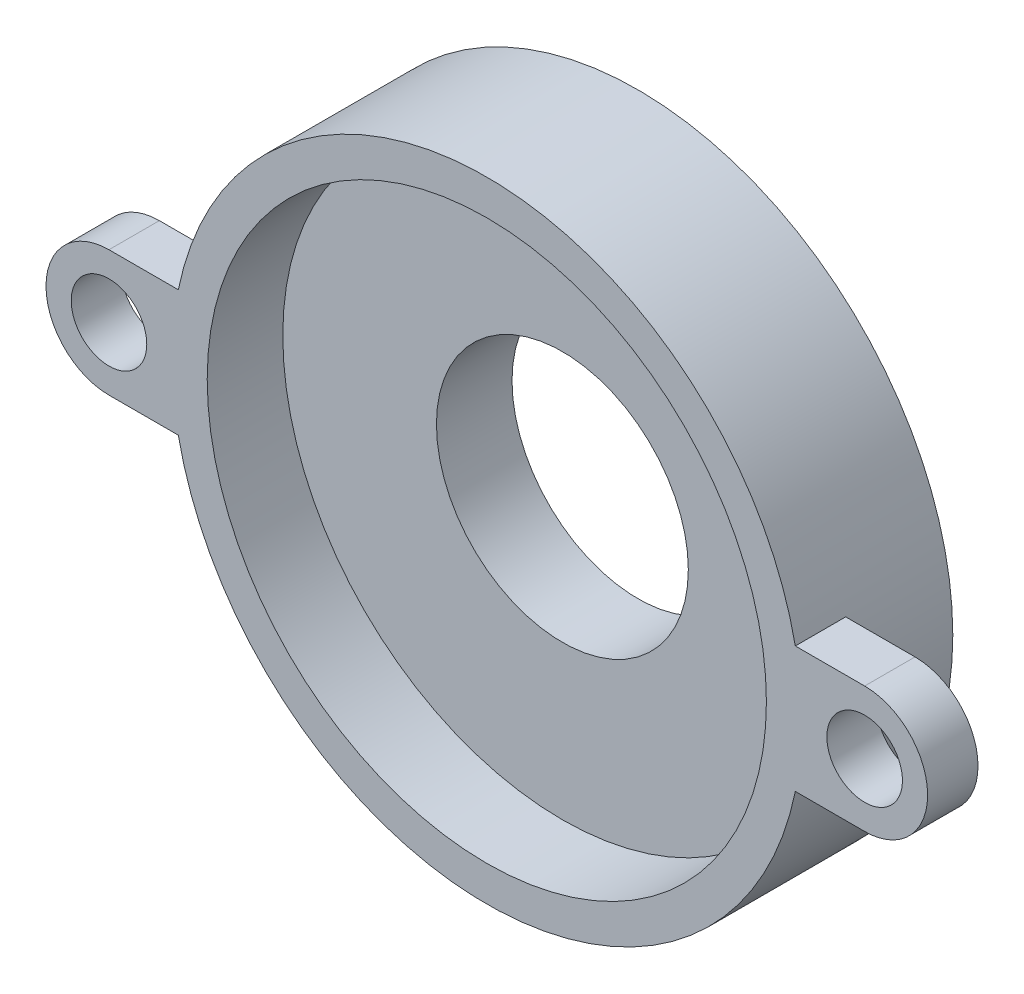
ISO-10303-21;
HEADER;
FILE_DESCRIPTION(('STEP AP214'),'2;1');
FILE_NAME('part.step','',(''),(''),'','','');
FILE_SCHEMA(('AUTOMOTIVE_DESIGN { 1 0 10303 214 1 1 1 1 }'));
ENDSEC;
DATA;
#1=APPLICATION_CONTEXT('core data for automotive mechanical design processes');
#2=APPLICATION_PROTOCOL_DEFINITION('international standard','automotive_design',2000,#1);
#3=PRODUCT_CONTEXT('',#1,'mechanical');
#4=PRODUCT('Part','Part','',(#3));
#5=PRODUCT_RELATED_PRODUCT_CATEGORY('part','',(#4));
#6=PRODUCT_DEFINITION_FORMATION('','',#4);
#7=PRODUCT_DEFINITION_CONTEXT('part definition',#1,'design');
#8=PRODUCT_DEFINITION('design','',#6,#7);
#9=PRODUCT_DEFINITION_SHAPE('','',#8);
#10=(LENGTH_UNIT() NAMED_UNIT(*) SI_UNIT(.MILLI.,.METRE.));
#11=(NAMED_UNIT(*) PLANE_ANGLE_UNIT() SI_UNIT($,.RADIAN.));
#12=(NAMED_UNIT(*) SI_UNIT($,.STERADIAN.) SOLID_ANGLE_UNIT());
#13=UNCERTAINTY_MEASURE_WITH_UNIT(LENGTH_MEASURE(1.E-05),#10,'distance_accuracy_value','');
#14=(GEOMETRIC_REPRESENTATION_CONTEXT(3) GLOBAL_UNCERTAINTY_ASSIGNED_CONTEXT((#13)) GLOBAL_UNIT_ASSIGNED_CONTEXT((#10,
#11,#12)) REPRESENTATION_CONTEXT('',''));
#15=CARTESIAN_POINT('',(0.,0.,0.));
#16=DIRECTION('',(0.,0.,1.));
#17=DIRECTION('',(1.,0.,0.));
#18=AXIS2_PLACEMENT_3D('',#15,#16,#17);
#19=CARTESIAN_POINT('',(0.,0.,6.));
#20=DIRECTION('',(0.,0.,-1.));
#21=DIRECTION('',(-1.,0.,0.));
#22=AXIS2_PLACEMENT_3D('',#19,#20,#21);
#23=CYLINDRICAL_SURFACE('',#22,5.);
#24=CARTESIAN_POINT('',(0.,0.,0.));
#25=DIRECTION('',(0.,0.,1.));
#26=DIRECTION('',(1.,0.,0.));
#27=AXIS2_PLACEMENT_3D('',#24,#25,#26);
#28=CIRCLE('',#27,5.);
#29=CARTESIAN_POINT('',(5.,0.,0.));
#30=VERTEX_POINT('',#29);
#31=EDGE_CURVE('E182',#30,#30,#28,.T.);
#32=ORIENTED_EDGE('',*,*,#31,.F.);
#33=EDGE_LOOP('',(#32));
#34=FACE_BOUND('',#33,.T.);
#35=CARTESIAN_POINT('',(0.,0.,3.));
#36=DIRECTION('',(0.,0.,1.));
#37=DIRECTION('',(1.,0.,0.));
#38=AXIS2_PLACEMENT_3D('',#35,#36,#37);
#39=CIRCLE('',#38,5.);
#40=CARTESIAN_POINT('',(5.,0.,3.));
#41=VERTEX_POINT('',#40);
#42=EDGE_CURVE('E39',#41,#41,#39,.T.);
#43=ORIENTED_EDGE('',*,*,#42,.T.);
#44=EDGE_LOOP('',(#43));
#45=FACE_BOUND('',#44,.T.);
#46=ADVANCED_FACE('F35',(#34,#45),#23,.F.);
#47=CARTESIAN_POINT('',(0.,0.,6.));
#48=DIRECTION('',(0.,0.,1.));
#49=DIRECTION('',(1.,0.,0.));
#50=AXIS2_PLACEMENT_3D('',#47,#48,#49);
#51=PLANE('',#50);
#52=CARTESIAN_POINT('',(0.,0.,6.));
#53=DIRECTION('',(0.,0.,1.));
#54=DIRECTION('',(1.,0.,0.));
#55=AXIS2_PLACEMENT_3D('',#52,#53,#54);
#56=CIRCLE('',#55,11.1);
#57=CARTESIAN_POINT('',(11.1,0.,6.));
#58=VERTEX_POINT('',#57);
#59=EDGE_CURVE('E170',#58,#58,#56,.T.);
#60=ORIENTED_EDGE('',*,*,#59,.F.);
#61=EDGE_LOOP('',(#60));
#62=FACE_BOUND('',#61,.T.);
#63=CARTESIAN_POINT('',(0.,0.,6.));
#64=DIRECTION('',(0.,0.,1.));
#65=DIRECTION('',(1.,0.,0.));
#66=AXIS2_PLACEMENT_3D('',#63,#64,#65);
#67=CIRCLE('',#66,12.5);
#68=CARTESIAN_POINT('',(-12.2474487139159,-2.5,6.));
#69=VERTEX_POINT('',#68);
#70=CARTESIAN_POINT('',(12.2474487139159,-2.49999999999999,6.));
#71=VERTEX_POINT('',#70);
#72=EDGE_CURVE('E11',#69,#71,#67,.T.);
#73=ORIENTED_EDGE('',*,*,#72,.T.);
#74=DIRECTION('',(1.,0.,0.));
#75=VECTOR('',#74,1.);
#76=CARTESIAN_POINT('',(15.,-2.49999999999999,6.));
#77=LINE('',#76,#75);
#78=CARTESIAN_POINT('',(15.,-2.49999999999999,6.));
#79=VERTEX_POINT('',#78);
#80=EDGE_CURVE('E124',#71,#79,#77,.T.);
#81=ORIENTED_EDGE('',*,*,#80,.T.);
#82=CARTESIAN_POINT('',(15.,0.,6.));
#83=DIRECTION('',(0.,0.,1.));
#84=DIRECTION('',(-1.,0.,0.));
#85=AXIS2_PLACEMENT_3D('',#82,#83,#84);
#86=CIRCLE('',#85,2.5);
#87=CARTESIAN_POINT('',(15.,2.50000000000001,6.));
#88=VERTEX_POINT('',#87);
#89=EDGE_CURVE('E134',#79,#88,#86,.T.);
#90=ORIENTED_EDGE('',*,*,#89,.T.);
#91=DIRECTION('',(-1.,0.,0.));
#92=VECTOR('',#91,1.);
#93=CARTESIAN_POINT('',(15.,2.50000000000001,6.));
#94=LINE('',#93,#92);
#95=CARTESIAN_POINT('',(12.2474487139159,2.50000000000001,6.));
#96=VERTEX_POINT('',#95);
#97=EDGE_CURVE('E52',#88,#96,#94,.T.);
#98=ORIENTED_EDGE('',*,*,#97,.T.);
#99=CARTESIAN_POINT('',(-12.2474487139159,2.5,6.));
#100=VERTEX_POINT('',#99);
#101=EDGE_CURVE('E44',#96,#100,#67,.T.);
#102=ORIENTED_EDGE('',*,*,#101,.T.);
#103=DIRECTION('',(-1.,0.,0.));
#104=VECTOR('',#103,1.);
#105=CARTESIAN_POINT('',(-15.,2.5,6.));
#106=LINE('',#105,#104);
#107=CARTESIAN_POINT('',(-15.,2.5,6.));
#108=VERTEX_POINT('',#107);
#109=EDGE_CURVE('E154',#100,#108,#106,.T.);
#110=ORIENTED_EDGE('',*,*,#109,.T.);
#111=CARTESIAN_POINT('',(-15.,0.,6.));
#112=DIRECTION('',(0.,0.,1.));
#113=DIRECTION('',(1.,0.,0.));
#114=AXIS2_PLACEMENT_3D('',#111,#112,#113);
#115=CIRCLE('',#114,2.5);
#116=CARTESIAN_POINT('',(-15.,-2.5,6.));
#117=VERTEX_POINT('',#116);
#118=EDGE_CURVE('E147',#108,#117,#115,.T.);
#119=ORIENTED_EDGE('',*,*,#118,.T.);
#120=DIRECTION('',(1.,0.,0.));
#121=VECTOR('',#120,1.);
#122=CARTESIAN_POINT('',(-15.,-2.5,6.));
#123=LINE('',#122,#121);
#124=EDGE_CURVE('E58',#117,#69,#123,.T.);
#125=ORIENTED_EDGE('',*,*,#124,.T.);
#126=EDGE_LOOP('',(#73,#81,#90,#98,#102,#110,#119,#125));
#127=FACE_BOUND('',#126,.T.);
#128=CARTESIAN_POINT('',(-15.,0.,6.));
#129=DIRECTION('',(0.,0.,1.));
#130=DIRECTION('',(1.,0.,0.));
#131=AXIS2_PLACEMENT_3D('',#128,#129,#130);
#132=CIRCLE('',#131,1.5);
#133=CARTESIAN_POINT('',(-13.5,0.,6.));
#134=VERTEX_POINT('',#133);
#135=EDGE_CURVE('E139',#134,#134,#132,.T.);
#136=ORIENTED_EDGE('',*,*,#135,.F.);
#137=EDGE_LOOP('',(#136));
#138=FACE_BOUND('',#137,.T.);
#139=CARTESIAN_POINT('',(15.,0.,6.));
#140=DIRECTION('',(0.,0.,1.));
#141=DIRECTION('',(-1.,0.,0.));
#142=AXIS2_PLACEMENT_3D('',#139,#140,#141);
#143=CIRCLE('',#142,1.5);
#144=CARTESIAN_POINT('',(13.5,0.,6.));
#145=VERTEX_POINT('',#144);
#146=EDGE_CURVE('E129',#145,#145,#143,.T.);
#147=ORIENTED_EDGE('',*,*,#146,.F.);
#148=EDGE_LOOP('',(#147));
#149=FACE_BOUND('',#148,.T.);
#150=ADVANCED_FACE('F190',(#62,#127,#138,#149),#51,.T.);
#151=CARTESIAN_POINT('',(0.,0.,0.));
#152=DIRECTION('',(0.,0.,1.));
#153=DIRECTION('',(1.,0.,0.));
#154=AXIS2_PLACEMENT_3D('',#151,#152,#153);
#155=PLANE('',#154);
#156=CARTESIAN_POINT('',(0.,0.,0.));
#157=DIRECTION('',(0.,0.,1.));
#158=DIRECTION('',(1.,0.,0.));
#159=AXIS2_PLACEMENT_3D('',#156,#157,#158);
#160=CIRCLE('',#159,12.5);
#161=CARTESIAN_POINT('',(12.5,0.,0.));
#162=VERTEX_POINT('',#161);
#163=EDGE_CURVE('E184',#162,#162,#160,.T.);
#164=ORIENTED_EDGE('',*,*,#163,.F.);
#165=EDGE_LOOP('',(#164));
#166=FACE_BOUND('',#165,.T.);
#167=ORIENTED_EDGE('',*,*,#31,.T.);
#168=EDGE_LOOP('',(#167));
#169=FACE_BOUND('',#168,.T.);
#170=ADVANCED_FACE('F225',(#166,#169),#155,.F.);
#171=CARTESIAN_POINT('',(0.,0.,6.));
#172=DIRECTION('',(0.,0.,-1.));
#173=DIRECTION('',(-1.,0.,0.));
#174=AXIS2_PLACEMENT_3D('',#171,#172,#173);
#175=CYLINDRICAL_SURFACE('',#174,12.5);
#176=CARTESIAN_POINT('',(0.,0.,4.));
#177=DIRECTION('',(0.,0.,-1.));
#178=DIRECTION('',(-1.,0.,0.));
#179=AXIS2_PLACEMENT_3D('',#176,#177,#178);
#180=CIRCLE('',#179,12.4999999999999);
#181=CARTESIAN_POINT('',(12.2474487139159,2.5,4.));
#182=VERTEX_POINT('',#181);
#183=CARTESIAN_POINT('',(12.2474487139159,-2.49999999999999,4.));
#184=VERTEX_POINT('',#183);
#185=EDGE_CURVE('E120',#182,#184,#180,.T.);
#186=ORIENTED_EDGE('',*,*,#185,.T.);
#187=DIRECTION('',(0.,0.,1.));
#188=VECTOR('',#187,1.);
#189=CARTESIAN_POINT('',(12.2474487139159,-2.49999999999999,4.));
#190=LINE('',#189,#188);
#191=EDGE_CURVE('E140',#184,#71,#190,.T.);
#192=ORIENTED_EDGE('',*,*,#191,.T.);
#193=ORIENTED_EDGE('',*,*,#72,.F.);
#194=DIRECTION('',(0.,0.,1.));
#195=VECTOR('',#194,1.);
#196=CARTESIAN_POINT('',(-12.2474487139159,-2.5,4.));
#197=LINE('',#196,#195);
#198=CARTESIAN_POINT('',(-12.2474487139159,-2.5,4.));
#199=VERTEX_POINT('',#198);
#200=EDGE_CURVE('E174',#199,#69,#197,.T.);
#201=ORIENTED_EDGE('',*,*,#200,.F.);
#202=CARTESIAN_POINT('',(0.,0.,4.));
#203=DIRECTION('',(0.,0.,-1.));
#204=DIRECTION('',(1.,0.,0.));
#205=AXIS2_PLACEMENT_3D('',#202,#203,#204);
#206=CIRCLE('',#205,12.5000000000001);
#207=CARTESIAN_POINT('',(-12.2474487139159,2.5,4.));
#208=VERTEX_POINT('',#207);
#209=EDGE_CURVE('E157',#199,#208,#206,.T.);
#210=ORIENTED_EDGE('',*,*,#209,.T.);
#211=DIRECTION('',(0.,0.,1.));
#212=VECTOR('',#211,1.);
#213=CARTESIAN_POINT('',(-12.2474487139159,2.5,4.));
#214=LINE('',#213,#212);
#215=EDGE_CURVE('E171',#208,#100,#214,.T.);
#216=ORIENTED_EDGE('',*,*,#215,.T.);
#217=ORIENTED_EDGE('',*,*,#101,.F.);
#218=DIRECTION('',(0.,0.,1.));
#219=VECTOR('',#218,1.);
#220=CARTESIAN_POINT('',(12.2474487139159,2.5,4.));
#221=LINE('',#220,#219);
#222=EDGE_CURVE('E110',#182,#96,#221,.T.);
#223=ORIENTED_EDGE('',*,*,#222,.F.);
#224=EDGE_LOOP('',(#186,#192,#193,#201,#210,#216,#217,#223));
#225=FACE_BOUND('',#224,.T.);
#226=ORIENTED_EDGE('',*,*,#163,.T.);
#227=EDGE_LOOP('',(#226));
#228=FACE_BOUND('',#227,.T.);
#229=ADVANCED_FACE('F37',(#225,#228),#175,.T.);
#230=CARTESIAN_POINT('',(0.,0.,3.));
#231=DIRECTION('',(0.,0.,1.));
#232=DIRECTION('',(1.,0.,0.));
#233=AXIS2_PLACEMENT_3D('',#230,#231,#232);
#234=CYLINDRICAL_SURFACE('',#233,11.1);
#235=CARTESIAN_POINT('',(0.,0.,3.));
#236=DIRECTION('',(0.,0.,1.));
#237=DIRECTION('',(1.,0.,0.));
#238=AXIS2_PLACEMENT_3D('',#235,#236,#237);
#239=CIRCLE('',#238,11.1);
#240=CARTESIAN_POINT('',(11.1,0.,3.));
#241=VERTEX_POINT('',#240);
#242=EDGE_CURVE('E177',#241,#241,#239,.T.);
#243=ORIENTED_EDGE('',*,*,#242,.F.);
#244=EDGE_LOOP('',(#243));
#245=FACE_BOUND('',#244,.T.);
#246=ORIENTED_EDGE('',*,*,#59,.T.);
#247=EDGE_LOOP('',(#246));
#248=FACE_BOUND('',#247,.T.);
#249=ADVANCED_FACE('F215',(#245,#248),#234,.F.);
#250=CARTESIAN_POINT('',(0.,0.,3.));
#251=DIRECTION('',(0.,0.,1.));
#252=DIRECTION('',(1.,0.,0.));
#253=AXIS2_PLACEMENT_3D('',#250,#251,#252);
#254=PLANE('',#253);
#255=ORIENTED_EDGE('',*,*,#42,.F.);
#256=EDGE_LOOP('',(#255));
#257=FACE_BOUND('',#256,.T.);
#258=ORIENTED_EDGE('',*,*,#242,.T.);
#259=EDGE_LOOP('',(#258));
#260=FACE_BOUND('',#259,.T.);
#261=ADVANCED_FACE('F208',(#257,#260),#254,.T.);
#262=CARTESIAN_POINT('',(-15.,0.,4.));
#263=DIRECTION('',(0.,0.,1.));
#264=DIRECTION('',(1.,0.,0.));
#265=AXIS2_PLACEMENT_3D('',#262,#263,#264);
#266=CYLINDRICAL_SURFACE('',#265,2.5);
#267=ORIENTED_EDGE('',*,*,#118,.F.);
#268=DIRECTION('',(0.,0.,1.));
#269=VECTOR('',#268,1.);
#270=CARTESIAN_POINT('',(-15.,2.5,4.));
#271=LINE('',#270,#269);
#272=CARTESIAN_POINT('',(-15.,2.5,4.));
#273=VERTEX_POINT('',#272);
#274=EDGE_CURVE('E168',#273,#108,#271,.T.);
#275=ORIENTED_EDGE('',*,*,#274,.F.);
#276=CARTESIAN_POINT('',(-15.,0.,4.));
#277=DIRECTION('',(0.,0.,1.));
#278=DIRECTION('',(1.,0.,0.));
#279=AXIS2_PLACEMENT_3D('',#276,#277,#278);
#280=CIRCLE('',#279,2.5);
#281=CARTESIAN_POINT('',(-15.,-2.5,4.));
#282=VERTEX_POINT('',#281);
#283=EDGE_CURVE('E150',#273,#282,#280,.T.);
#284=ORIENTED_EDGE('',*,*,#283,.T.);
#285=DIRECTION('',(0.,0.,1.));
#286=VECTOR('',#285,1.);
#287=CARTESIAN_POINT('',(-15.,-2.5,4.));
#288=LINE('',#287,#286);
#289=EDGE_CURVE('E163',#282,#117,#288,.T.);
#290=ORIENTED_EDGE('',*,*,#289,.T.);
#291=EDGE_LOOP('',(#267,#275,#284,#290));
#292=FACE_BOUND('',#291,.T.);
#293=ADVANCED_FACE('F206',(#292),#266,.T.);
#294=CARTESIAN_POINT('',(-15.,2.5,4.));
#295=DIRECTION('',(0.,1.,0.));
#296=DIRECTION('',(0.,0.,1.));
#297=AXIS2_PLACEMENT_3D('',#294,#295,#296);
#298=PLANE('',#297);
#299=ORIENTED_EDGE('',*,*,#109,.F.);
#300=ORIENTED_EDGE('',*,*,#215,.F.);
#301=DIRECTION('',(-1.,0.,0.));
#302=VECTOR('',#301,1.);
#303=CARTESIAN_POINT('',(-15.,2.5,4.));
#304=LINE('',#303,#302);
#305=EDGE_CURVE('E160',#208,#273,#304,.T.);
#306=ORIENTED_EDGE('',*,*,#305,.T.);
#307=ORIENTED_EDGE('',*,*,#274,.T.);
#308=EDGE_LOOP('',(#299,#300,#306,#307));
#309=FACE_BOUND('',#308,.T.);
#310=ADVANCED_FACE('F194',(#309),#298,.T.);
#311=CARTESIAN_POINT('',(-15.,-2.5,4.));
#312=DIRECTION('',(0.,-1.,0.));
#313=DIRECTION('',(0.,0.,-1.));
#314=AXIS2_PLACEMENT_3D('',#311,#312,#313);
#315=PLANE('',#314);
#316=ORIENTED_EDGE('',*,*,#124,.F.);
#317=ORIENTED_EDGE('',*,*,#289,.F.);
#318=DIRECTION('',(1.,0.,0.));
#319=VECTOR('',#318,1.);
#320=CARTESIAN_POINT('',(-15.,-2.5,4.));
#321=LINE('',#320,#319);
#322=EDGE_CURVE('E153',#282,#199,#321,.T.);
#323=ORIENTED_EDGE('',*,*,#322,.T.);
#324=ORIENTED_EDGE('',*,*,#200,.T.);
#325=EDGE_LOOP('',(#316,#317,#323,#324));
#326=FACE_BOUND('',#325,.T.);
#327=ADVANCED_FACE('F204',(#326),#315,.T.);
#328=CARTESIAN_POINT('',(-15.,0.,4.));
#329=DIRECTION('',(0.,0.,1.));
#330=DIRECTION('',(1.,0.,0.));
#331=AXIS2_PLACEMENT_3D('',#328,#329,#330);
#332=PLANE('',#331);
#333=CARTESIAN_POINT('',(-15.,0.,4.));
#334=DIRECTION('',(0.,0.,1.));
#335=DIRECTION('',(1.,0.,0.));
#336=AXIS2_PLACEMENT_3D('',#333,#334,#335);
#337=CIRCLE('',#336,1.5);
#338=CARTESIAN_POINT('',(-13.5,0.,4.));
#339=VERTEX_POINT('',#338);
#340=EDGE_CURVE('E144',#339,#339,#337,.T.);
#341=ORIENTED_EDGE('',*,*,#340,.T.);
#342=EDGE_LOOP('',(#341));
#343=FACE_BOUND('',#342,.T.);
#344=ORIENTED_EDGE('',*,*,#283,.F.);
#345=ORIENTED_EDGE('',*,*,#305,.F.);
#346=ORIENTED_EDGE('',*,*,#209,.F.);
#347=ORIENTED_EDGE('',*,*,#322,.F.);
#348=EDGE_LOOP('',(#344,#345,#346,#347));
#349=FACE_BOUND('',#348,.T.);
#350=ADVANCED_FACE('F202',(#343,#349),#332,.F.);
#351=CARTESIAN_POINT('',(-15.,0.,4.));
#352=DIRECTION('',(0.,0.,1.));
#353=DIRECTION('',(1.,0.,0.));
#354=AXIS2_PLACEMENT_3D('',#351,#352,#353);
#355=CYLINDRICAL_SURFACE('',#354,1.5);
#356=ORIENTED_EDGE('',*,*,#340,.F.);
#357=EDGE_LOOP('',(#356));
#358=FACE_BOUND('',#357,.T.);
#359=ORIENTED_EDGE('',*,*,#135,.T.);
#360=EDGE_LOOP('',(#359));
#361=FACE_BOUND('',#360,.T.);
#362=ADVANCED_FACE('F290',(#358,#361),#355,.F.);
#363=CARTESIAN_POINT('',(15.,0.,4.));
#364=DIRECTION('',(0.,0.,1.));
#365=DIRECTION('',(1.,0.,0.));
#366=AXIS2_PLACEMENT_3D('',#363,#364,#365);
#367=CYLINDRICAL_SURFACE('',#366,2.5);
#368=ORIENTED_EDGE('',*,*,#89,.F.);
#369=DIRECTION('',(0.,0.,1.));
#370=VECTOR('',#369,1.);
#371=CARTESIAN_POINT('',(15.,-2.49999999999999,4.));
#372=LINE('',#371,#370);
#373=CARTESIAN_POINT('',(15.,-2.49999999999999,4.));
#374=VERTEX_POINT('',#373);
#375=EDGE_CURVE('E123',#374,#79,#372,.T.);
#376=ORIENTED_EDGE('',*,*,#375,.F.);
#377=CARTESIAN_POINT('',(15.,0.,4.));
#378=DIRECTION('',(0.,0.,1.));
#379=DIRECTION('',(-1.,0.,0.));
#380=AXIS2_PLACEMENT_3D('',#377,#378,#379);
#381=CIRCLE('',#380,2.5);
#382=CARTESIAN_POINT('',(15.,2.50000000000001,4.));
#383=VERTEX_POINT('',#382);
#384=EDGE_CURVE('E117',#374,#383,#381,.T.);
#385=ORIENTED_EDGE('',*,*,#384,.T.);
#386=DIRECTION('',(0.,0.,1.));
#387=VECTOR('',#386,1.);
#388=CARTESIAN_POINT('',(15.,2.50000000000001,4.));
#389=LINE('',#388,#387);
#390=EDGE_CURVE('E102',#383,#88,#389,.T.);
#391=ORIENTED_EDGE('',*,*,#390,.T.);
#392=EDGE_LOOP('',(#368,#376,#385,#391));
#393=FACE_BOUND('',#392,.T.);
#394=ADVANCED_FACE('F122',(#393),#367,.T.);
#395=CARTESIAN_POINT('',(15.,-2.49999999999999,4.));
#396=DIRECTION('',(0.,-1.,0.));
#397=DIRECTION('',(0.,0.,-1.));
#398=AXIS2_PLACEMENT_3D('',#395,#396,#397);
#399=PLANE('',#398);
#400=ORIENTED_EDGE('',*,*,#80,.F.);
#401=ORIENTED_EDGE('',*,*,#191,.F.);
#402=DIRECTION('',(1.,0.,0.));
#403=VECTOR('',#402,1.);
#404=CARTESIAN_POINT('',(15.,-2.49999999999999,4.));
#405=LINE('',#404,#403);
#406=EDGE_CURVE('E111',#184,#374,#405,.T.);
#407=ORIENTED_EDGE('',*,*,#406,.T.);
#408=ORIENTED_EDGE('',*,*,#375,.T.);
#409=EDGE_LOOP('',(#400,#401,#407,#408));
#410=FACE_BOUND('',#409,.T.);
#411=ADVANCED_FACE('F309',(#410),#399,.T.);
#412=CARTESIAN_POINT('',(15.,2.50000000000001,4.));
#413=DIRECTION('',(0.,1.,0.));
#414=DIRECTION('',(0.,0.,1.));
#415=AXIS2_PLACEMENT_3D('',#412,#413,#414);
#416=PLANE('',#415);
#417=ORIENTED_EDGE('',*,*,#97,.F.);
#418=ORIENTED_EDGE('',*,*,#390,.F.);
#419=DIRECTION('',(-1.,0.,0.));
#420=VECTOR('',#419,1.);
#421=CARTESIAN_POINT('',(15.,2.50000000000001,4.));
#422=LINE('',#421,#420);
#423=EDGE_CURVE('E105',#383,#182,#422,.T.);
#424=ORIENTED_EDGE('',*,*,#423,.T.);
#425=ORIENTED_EDGE('',*,*,#222,.T.);
#426=EDGE_LOOP('',(#417,#418,#424,#425));
#427=FACE_BOUND('',#426,.T.);
#428=ADVANCED_FACE('F104',(#427),#416,.T.);
#429=CARTESIAN_POINT('',(15.,0.,4.));
#430=DIRECTION('',(0.,0.,-1.));
#431=DIRECTION('',(-1.,0.,0.));
#432=AXIS2_PLACEMENT_3D('',#429,#430,#431);
#433=PLANE('',#432);
#434=CARTESIAN_POINT('',(15.,0.,4.));
#435=DIRECTION('',(0.,0.,1.));
#436=DIRECTION('',(-1.,0.,0.));
#437=AXIS2_PLACEMENT_3D('',#434,#435,#436);
#438=CIRCLE('',#437,1.5);
#439=CARTESIAN_POINT('',(13.5,0.,4.));
#440=VERTEX_POINT('',#439);
#441=EDGE_CURVE('E136',#440,#440,#438,.T.);
#442=ORIENTED_EDGE('',*,*,#441,.T.);
#443=EDGE_LOOP('',(#442));
#444=FACE_BOUND('',#443,.T.);
#445=ORIENTED_EDGE('',*,*,#384,.F.);
#446=ORIENTED_EDGE('',*,*,#406,.F.);
#447=ORIENTED_EDGE('',*,*,#185,.F.);
#448=ORIENTED_EDGE('',*,*,#423,.F.);
#449=EDGE_LOOP('',(#445,#446,#447,#448));
#450=FACE_BOUND('',#449,.T.);
#451=ADVANCED_FACE('F115',(#444,#450),#433,.T.);
#452=CARTESIAN_POINT('',(15.,0.,4.));
#453=DIRECTION('',(0.,0.,1.));
#454=DIRECTION('',(1.,0.,0.));
#455=AXIS2_PLACEMENT_3D('',#452,#453,#454);
#456=CYLINDRICAL_SURFACE('',#455,1.5);
#457=ORIENTED_EDGE('',*,*,#441,.F.);
#458=EDGE_LOOP('',(#457));
#459=FACE_BOUND('',#458,.T.);
#460=ORIENTED_EDGE('',*,*,#146,.T.);
#461=EDGE_LOOP('',(#460));
#462=FACE_BOUND('',#461,.T.);
#463=ADVANCED_FACE('F335',(#459,#462),#456,.F.);
#464=CLOSED_SHELL('',(#46,#150,#170,#229,#249,#261,#293,#310,#327,#350,#362,#394,#411,#428,#451,#463));
#465=MANIFOLD_SOLID_BREP('B2',#464);
#466=ADVANCED_BREP_SHAPE_REPRESENTATION('',(#18,#465),#14);
#467=SHAPE_DEFINITION_REPRESENTATION(#9,#466);
ENDSEC;
END-ISO-10303-21;
